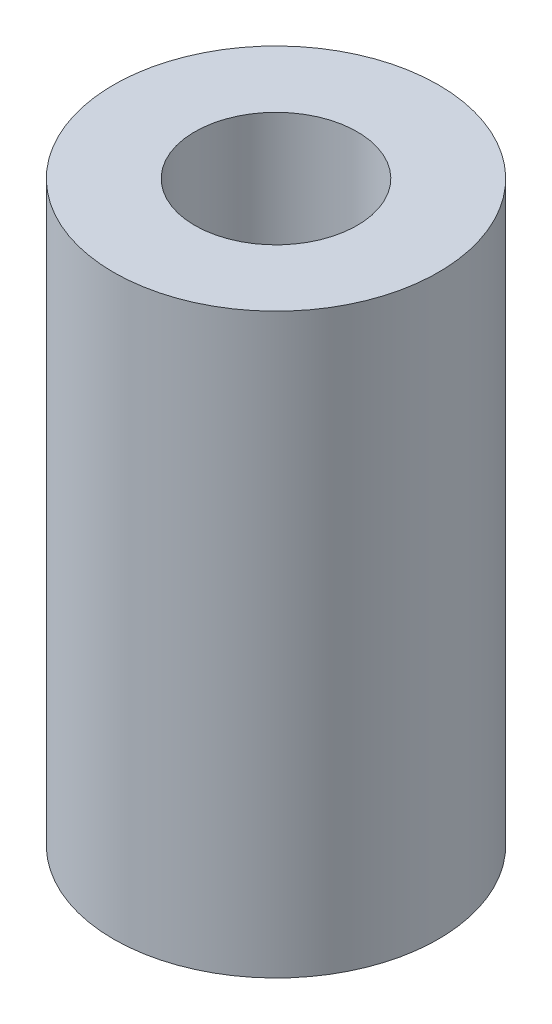
ISO-10303-21;
HEADER;
FILE_DESCRIPTION(('STEP AP214'),'2;1');
FILE_NAME('part.step','',(''),(''),'','','');
FILE_SCHEMA(('AUTOMOTIVE_DESIGN { 1 0 10303 214 1 1 1 1 }'));
ENDSEC;
DATA;
#1=APPLICATION_CONTEXT('core data for automotive mechanical design processes');
#2=APPLICATION_PROTOCOL_DEFINITION('international standard','automotive_design',2000,#1);
#3=PRODUCT_CONTEXT('',#1,'mechanical');
#4=PRODUCT('Part','Part','',(#3));
#5=PRODUCT_RELATED_PRODUCT_CATEGORY('part','',(#4));
#6=PRODUCT_DEFINITION_FORMATION('','',#4);
#7=PRODUCT_DEFINITION_CONTEXT('part definition',#1,'design');
#8=PRODUCT_DEFINITION('design','',#6,#7);
#9=PRODUCT_DEFINITION_SHAPE('','',#8);
#10=(LENGTH_UNIT() NAMED_UNIT(*) SI_UNIT(.MILLI.,.METRE.));
#11=(NAMED_UNIT(*) PLANE_ANGLE_UNIT() SI_UNIT($,.RADIAN.));
#12=(NAMED_UNIT(*) SI_UNIT($,.STERADIAN.) SOLID_ANGLE_UNIT());
#13=UNCERTAINTY_MEASURE_WITH_UNIT(LENGTH_MEASURE(1.E-05),#10,'distance_accuracy_value','');
#14=(GEOMETRIC_REPRESENTATION_CONTEXT(3) GLOBAL_UNCERTAINTY_ASSIGNED_CONTEXT((#13)) GLOBAL_UNIT_ASSIGNED_CONTEXT((#10,
#11,#12)) REPRESENTATION_CONTEXT('',''));
#15=CARTESIAN_POINT('',(0.,0.,0.));
#16=DIRECTION('',(0.,0.,1.));
#17=DIRECTION('',(1.,0.,0.));
#18=AXIS2_PLACEMENT_3D('',#15,#16,#17);
#19=CARTESIAN_POINT('',(0.,8.,0.));
#20=DIRECTION('',(0.,1.,0.));
#21=DIRECTION('',(0.,0.,1.));
#22=AXIS2_PLACEMENT_3D('',#19,#20,#21);
#23=PLANE('',#22);
#24=CARTESIAN_POINT('',(0.,8.,0.));
#25=DIRECTION('',(0.,1.,0.));
#26=DIRECTION('',(0.,0.,1.));
#27=AXIS2_PLACEMENT_3D('',#24,#25,#26);
#28=CIRCLE('',#27,4.5);
#29=CARTESIAN_POINT('',(0.,8.,4.5));
#30=VERTEX_POINT('',#29);
#31=EDGE_CURVE('E10',#30,#30,#28,.T.);
#32=ORIENTED_EDGE('',*,*,#31,.T.);
#33=EDGE_LOOP('',(#32));
#34=FACE_BOUND('',#33,.T.);
#35=CARTESIAN_POINT('',(0.,8.,0.));
#36=DIRECTION('',(0.,1.,0.));
#37=DIRECTION('',(0.,0.,1.));
#38=AXIS2_PLACEMENT_3D('',#35,#36,#37);
#39=CIRCLE('',#38,2.25);
#40=CARTESIAN_POINT('',(0.,8.,2.25));
#41=VERTEX_POINT('',#40);
#42=EDGE_CURVE('E50',#41,#41,#39,.T.);
#43=ORIENTED_EDGE('',*,*,#42,.F.);
#44=EDGE_LOOP('',(#43));
#45=FACE_BOUND('',#44,.T.);
#46=ADVANCED_FACE('F37',(#34,#45),#23,.T.);
#47=CARTESIAN_POINT('',(0.,-8.,0.));
#48=DIRECTION('',(0.,1.,0.));
#49=DIRECTION('',(0.,0.,1.));
#50=AXIS2_PLACEMENT_3D('',#47,#48,#49);
#51=PLANE('',#50);
#52=CARTESIAN_POINT('',(0.,-8.,0.));
#53=DIRECTION('',(0.,1.,0.));
#54=DIRECTION('',(0.,0.,1.));
#55=AXIS2_PLACEMENT_3D('',#52,#53,#54);
#56=CIRCLE('',#55,4.5);
#57=CARTESIAN_POINT('',(0.,-8.,4.5));
#58=VERTEX_POINT('',#57);
#59=EDGE_CURVE('E41',#58,#58,#56,.T.);
#60=ORIENTED_EDGE('',*,*,#59,.F.);
#61=EDGE_LOOP('',(#60));
#62=FACE_BOUND('',#61,.T.);
#63=CARTESIAN_POINT('',(0.,-8.,0.));
#64=DIRECTION('',(0.,1.,0.));
#65=DIRECTION('',(0.,0.,1.));
#66=AXIS2_PLACEMENT_3D('',#63,#64,#65);
#67=CIRCLE('',#66,2.25);
#68=CARTESIAN_POINT('',(0.,-8.,2.25));
#69=VERTEX_POINT('',#68);
#70=EDGE_CURVE('E52',#69,#69,#67,.T.);
#71=ORIENTED_EDGE('',*,*,#70,.T.);
#72=EDGE_LOOP('',(#71));
#73=FACE_BOUND('',#72,.T.);
#74=ADVANCED_FACE('F64',(#62,#73),#51,.F.);
#75=CARTESIAN_POINT('',(0.,8.,0.));
#76=DIRECTION('',(0.,-1.,0.));
#77=DIRECTION('',(0.,0.,-1.));
#78=AXIS2_PLACEMENT_3D('',#75,#76,#77);
#79=CYLINDRICAL_SURFACE('',#78,4.5);
#80=ORIENTED_EDGE('',*,*,#31,.F.);
#81=EDGE_LOOP('',(#80));
#82=FACE_BOUND('',#81,.T.);
#83=ORIENTED_EDGE('',*,*,#59,.T.);
#84=EDGE_LOOP('',(#83));
#85=FACE_BOUND('',#84,.T.);
#86=ADVANCED_FACE('F39',(#82,#85),#79,.T.);
#87=CARTESIAN_POINT('',(0.,8.,0.));
#88=DIRECTION('',(0.,-1.,0.));
#89=DIRECTION('',(0.,0.,-1.));
#90=AXIS2_PLACEMENT_3D('',#87,#88,#89);
#91=CYLINDRICAL_SURFACE('',#90,2.25);
#92=ORIENTED_EDGE('',*,*,#42,.T.);
#93=EDGE_LOOP('',(#92));
#94=FACE_BOUND('',#93,.T.);
#95=ORIENTED_EDGE('',*,*,#70,.F.);
#96=EDGE_LOOP('',(#95));
#97=FACE_BOUND('',#96,.T.);
#98=ADVANCED_FACE('F60',(#94,#97),#91,.F.);
#99=CLOSED_SHELL('',(#46,#74,#86,#98));
#100=MANIFOLD_SOLID_BREP('B2',#99);
#101=ADVANCED_BREP_SHAPE_REPRESENTATION('',(#18,#100),#14);
#102=SHAPE_DEFINITION_REPRESENTATION(#9,#101);
ENDSEC;
END-ISO-10303-21;
